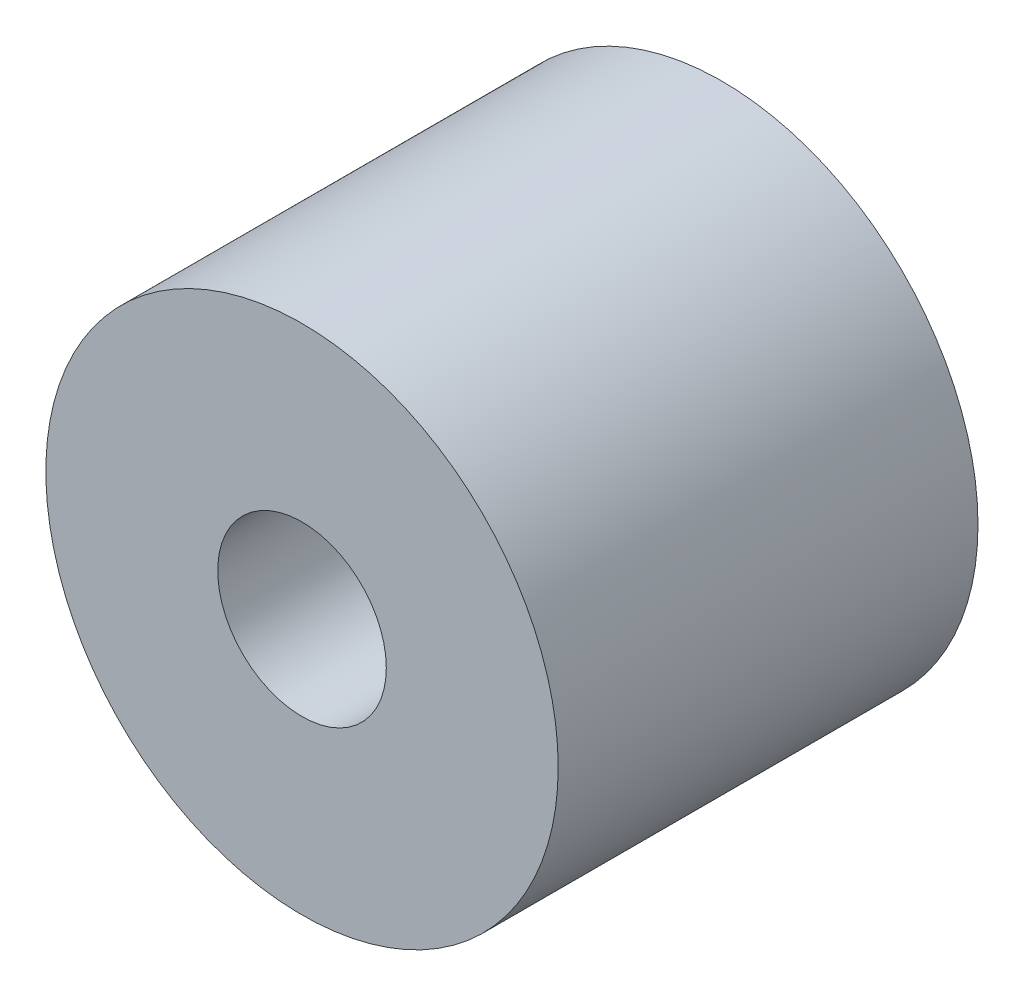
ISO-10303-21;
HEADER;
FILE_DESCRIPTION(('STEP AP214'),'2;1');
FILE_NAME('part.step','',(''),(''),'','','');
FILE_SCHEMA(('AUTOMOTIVE_DESIGN { 1 0 10303 214 1 1 1 1 }'));
ENDSEC;
DATA;
#1=APPLICATION_CONTEXT('core data for automotive mechanical design processes');
#2=APPLICATION_PROTOCOL_DEFINITION('international standard','automotive_design',2000,#1);
#3=PRODUCT_CONTEXT('',#1,'mechanical');
#4=PRODUCT('Part','Part','',(#3));
#5=PRODUCT_RELATED_PRODUCT_CATEGORY('part','',(#4));
#6=PRODUCT_DEFINITION_FORMATION('','',#4);
#7=PRODUCT_DEFINITION_CONTEXT('part definition',#1,'design');
#8=PRODUCT_DEFINITION('design','',#6,#7);
#9=PRODUCT_DEFINITION_SHAPE('','',#8);
#10=(LENGTH_UNIT() NAMED_UNIT(*) SI_UNIT(.MILLI.,.METRE.));
#11=(NAMED_UNIT(*) PLANE_ANGLE_UNIT() SI_UNIT($,.RADIAN.));
#12=(NAMED_UNIT(*) SI_UNIT($,.STERADIAN.) SOLID_ANGLE_UNIT());
#13=UNCERTAINTY_MEASURE_WITH_UNIT(LENGTH_MEASURE(1.E-05),#10,'distance_accuracy_value','');
#14=(GEOMETRIC_REPRESENTATION_CONTEXT(3) GLOBAL_UNCERTAINTY_ASSIGNED_CONTEXT((#13)) GLOBAL_UNIT_ASSIGNED_CONTEXT((#10,
#11,#12)) REPRESENTATION_CONTEXT('',''));
#15=CARTESIAN_POINT('',(0.,0.,0.));
#16=DIRECTION('',(0.,0.,1.));
#17=DIRECTION('',(1.,0.,0.));
#18=AXIS2_PLACEMENT_3D('',#15,#16,#17);
#19=CARTESIAN_POINT('',(0.,0.,6.35));
#20=DIRECTION('',(0.,0.,1.));
#21=DIRECTION('',(1.,0.,0.));
#22=AXIS2_PLACEMENT_3D('',#19,#20,#21);
#23=PLANE('',#22);
#24=CARTESIAN_POINT('',(0.,0.,6.35));
#25=DIRECTION('',(0.,0.,1.));
#26=DIRECTION('',(1.,0.,0.));
#27=AXIS2_PLACEMENT_3D('',#24,#25,#26);
#28=CIRCLE('',#27,7.75);
#29=CARTESIAN_POINT('',(7.75,0.,6.35));
#30=VERTEX_POINT('',#29);
#31=EDGE_CURVE('E10',#30,#30,#28,.T.);
#32=ORIENTED_EDGE('',*,*,#31,.T.);
#33=EDGE_LOOP('',(#32));
#34=FACE_BOUND('',#33,.T.);
#35=CARTESIAN_POINT('',(0.,0.,6.35));
#36=DIRECTION('',(0.,0.,1.));
#37=DIRECTION('',(1.,0.,0.));
#38=AXIS2_PLACEMENT_3D('',#35,#36,#37);
#39=CIRCLE('',#38,2.55);
#40=CARTESIAN_POINT('',(2.55,0.,6.35));
#41=VERTEX_POINT('',#40);
#42=EDGE_CURVE('E50',#41,#41,#39,.T.);
#43=ORIENTED_EDGE('',*,*,#42,.F.);
#44=EDGE_LOOP('',(#43));
#45=FACE_BOUND('',#44,.T.);
#46=ADVANCED_FACE('F37',(#34,#45),#23,.T.);
#47=CARTESIAN_POINT('',(0.,0.,-6.35));
#48=DIRECTION('',(0.,0.,1.));
#49=DIRECTION('',(1.,0.,0.));
#50=AXIS2_PLACEMENT_3D('',#47,#48,#49);
#51=PLANE('',#50);
#52=CARTESIAN_POINT('',(0.,0.,-6.35));
#53=DIRECTION('',(0.,0.,1.));
#54=DIRECTION('',(1.,0.,0.));
#55=AXIS2_PLACEMENT_3D('',#52,#53,#54);
#56=CIRCLE('',#55,7.75);
#57=CARTESIAN_POINT('',(7.75,0.,-6.35));
#58=VERTEX_POINT('',#57);
#59=EDGE_CURVE('E41',#58,#58,#56,.T.);
#60=ORIENTED_EDGE('',*,*,#59,.F.);
#61=EDGE_LOOP('',(#60));
#62=FACE_BOUND('',#61,.T.);
#63=CARTESIAN_POINT('',(0.,0.,-6.35));
#64=DIRECTION('',(0.,0.,1.));
#65=DIRECTION('',(1.,0.,0.));
#66=AXIS2_PLACEMENT_3D('',#63,#64,#65);
#67=CIRCLE('',#66,2.55);
#68=CARTESIAN_POINT('',(2.55,0.,-6.35));
#69=VERTEX_POINT('',#68);
#70=EDGE_CURVE('E52',#69,#69,#67,.T.);
#71=ORIENTED_EDGE('',*,*,#70,.T.);
#72=EDGE_LOOP('',(#71));
#73=FACE_BOUND('',#72,.T.);
#74=ADVANCED_FACE('F64',(#62,#73),#51,.F.);
#75=CARTESIAN_POINT('',(0.,0.,6.35));
#76=DIRECTION('',(0.,0.,-1.));
#77=DIRECTION('',(-1.,0.,0.));
#78=AXIS2_PLACEMENT_3D('',#75,#76,#77);
#79=CYLINDRICAL_SURFACE('',#78,7.75);
#80=ORIENTED_EDGE('',*,*,#31,.F.);
#81=EDGE_LOOP('',(#80));
#82=FACE_BOUND('',#81,.T.);
#83=ORIENTED_EDGE('',*,*,#59,.T.);
#84=EDGE_LOOP('',(#83));
#85=FACE_BOUND('',#84,.T.);
#86=ADVANCED_FACE('F39',(#82,#85),#79,.T.);
#87=CARTESIAN_POINT('',(0.,0.,6.35));
#88=DIRECTION('',(0.,0.,-1.));
#89=DIRECTION('',(-1.,0.,0.));
#90=AXIS2_PLACEMENT_3D('',#87,#88,#89);
#91=CYLINDRICAL_SURFACE('',#90,2.55);
#92=ORIENTED_EDGE('',*,*,#42,.T.);
#93=EDGE_LOOP('',(#92));
#94=FACE_BOUND('',#93,.T.);
#95=ORIENTED_EDGE('',*,*,#70,.F.);
#96=EDGE_LOOP('',(#95));
#97=FACE_BOUND('',#96,.T.);
#98=ADVANCED_FACE('F60',(#94,#97),#91,.F.);
#99=CLOSED_SHELL('',(#46,#74,#86,#98));
#100=MANIFOLD_SOLID_BREP('B2',#99);
#101=ADVANCED_BREP_SHAPE_REPRESENTATION('',(#18,#100),#14);
#102=SHAPE_DEFINITION_REPRESENTATION(#9,#101);
ENDSEC;
END-ISO-10303-21;
